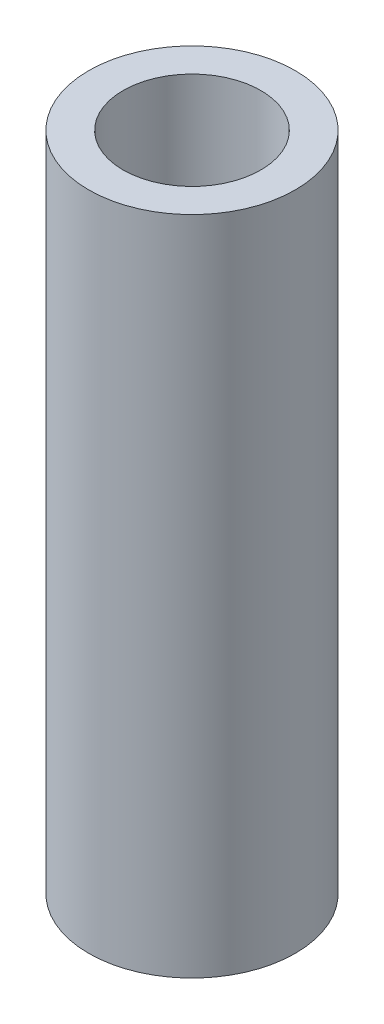
ISO-10303-21;
HEADER;
FILE_DESCRIPTION(('STEP AP214'),'2;1');
FILE_NAME('part.step','',(''),(''),'','','');
FILE_SCHEMA(('AUTOMOTIVE_DESIGN { 1 0 10303 214 1 1 1 1 }'));
ENDSEC;
DATA;
#1=APPLICATION_CONTEXT('core data for automotive mechanical design processes');
#2=APPLICATION_PROTOCOL_DEFINITION('international standard','automotive_design',2000,#1);
#3=PRODUCT_CONTEXT('',#1,'mechanical');
#4=PRODUCT('Part','Part','',(#3));
#5=PRODUCT_RELATED_PRODUCT_CATEGORY('part','',(#4));
#6=PRODUCT_DEFINITION_FORMATION('','',#4);
#7=PRODUCT_DEFINITION_CONTEXT('part definition',#1,'design');
#8=PRODUCT_DEFINITION('design','',#6,#7);
#9=PRODUCT_DEFINITION_SHAPE('','',#8);
#10=(LENGTH_UNIT() NAMED_UNIT(*) SI_UNIT(.MILLI.,.METRE.));
#11=(NAMED_UNIT(*) PLANE_ANGLE_UNIT() SI_UNIT($,.RADIAN.));
#12=(NAMED_UNIT(*) SI_UNIT($,.STERADIAN.) SOLID_ANGLE_UNIT());
#13=UNCERTAINTY_MEASURE_WITH_UNIT(LENGTH_MEASURE(1.E-05),#10,'distance_accuracy_value','');
#14=(GEOMETRIC_REPRESENTATION_CONTEXT(3) GLOBAL_UNCERTAINTY_ASSIGNED_CONTEXT((#13)) GLOBAL_UNIT_ASSIGNED_CONTEXT((#10,
#11,#12)) REPRESENTATION_CONTEXT('',''));
#15=CARTESIAN_POINT('',(0.,0.,0.));
#16=DIRECTION('',(0.,0.,1.));
#17=DIRECTION('',(1.,0.,0.));
#18=AXIS2_PLACEMENT_3D('',#15,#16,#17);
#19=CARTESIAN_POINT('',(0.,-30.48,0.));
#20=DIRECTION('',(0.,1.,0.));
#21=DIRECTION('',(0.,0.,1.));
#22=AXIS2_PLACEMENT_3D('',#19,#20,#21);
#23=CYLINDRICAL_SURFACE('',#22,9.525);
#24=CARTESIAN_POINT('',(0.,-30.48,0.));
#25=DIRECTION('',(0.,1.,0.));
#26=DIRECTION('',(0.,0.,1.));
#27=AXIS2_PLACEMENT_3D('',#24,#25,#26);
#28=CIRCLE('',#27,9.525);
#29=CARTESIAN_POINT('',(0.,-30.48,9.525));
#30=VERTEX_POINT('',#29);
#31=EDGE_CURVE('E10',#30,#30,#28,.T.);
#32=CARTESIAN_POINT('',(0.,30.48,0.));
#33=DIRECTION('',(0.,1.,0.));
#34=DIRECTION('',(0.,0.,1.));
#35=AXIS2_PLACEMENT_3D('',#32,#33,#34);
#36=CIRCLE('',#35,9.525);
#37=CARTESIAN_POINT('',(0.,30.48,9.525));
#38=VERTEX_POINT('',#37);
#39=EDGE_CURVE('E34',#38,#38,#36,.T.);
#40=CARTESIAN_POINT('',(0.,-30.48,9.525));
#41=CARTESIAN_POINT('',(0.,-29.845,9.525));
#42=CARTESIAN_POINT('',(0.,-29.21,9.525));
#43=CARTESIAN_POINT('',(0.,-27.94,9.525));
#44=CARTESIAN_POINT('',(0.,-27.305,9.525));
#45=CARTESIAN_POINT('',(0.,-26.035,9.525));
#46=CARTESIAN_POINT('',(0.,-25.4,9.525));
#47=CARTESIAN_POINT('',(0.,-24.13,9.525));
#48=CARTESIAN_POINT('',(0.,-23.495,9.525));
#49=CARTESIAN_POINT('',(0.,-22.225,9.525));
#50=CARTESIAN_POINT('',(0.,-21.59,9.525));
#51=CARTESIAN_POINT('',(0.,-20.32,9.525));
#52=CARTESIAN_POINT('',(0.,-19.685,9.525));
#53=CARTESIAN_POINT('',(0.,-18.415,9.525));
#54=CARTESIAN_POINT('',(0.,-17.78,9.525));
#55=CARTESIAN_POINT('',(0.,-16.51,9.525));
#56=CARTESIAN_POINT('',(0.,-15.875,9.525));
#57=CARTESIAN_POINT('',(0.,-14.605,9.525));
#58=CARTESIAN_POINT('',(0.,-13.97,9.525));
#59=CARTESIAN_POINT('',(0.,-12.7,9.525));
#60=CARTESIAN_POINT('',(0.,-12.065,9.525));
#61=CARTESIAN_POINT('',(0.,-10.795,9.525));
#62=CARTESIAN_POINT('',(0.,-10.16,9.525));
#63=CARTESIAN_POINT('',(0.,-8.89,9.525));
#64=CARTESIAN_POINT('',(0.,-8.255,9.525));
#65=CARTESIAN_POINT('',(0.,-6.985,9.525));
#66=CARTESIAN_POINT('',(0.,-6.35,9.525));
#67=CARTESIAN_POINT('',(0.,-5.08,9.525));
#68=CARTESIAN_POINT('',(0.,-4.445,9.525));
#69=CARTESIAN_POINT('',(0.,-3.175,9.525));
#70=CARTESIAN_POINT('',(0.,-2.54,9.525));
#71=CARTESIAN_POINT('',(0.,-1.27,9.525));
#72=CARTESIAN_POINT('',(0.,-0.635,9.525));
#73=CARTESIAN_POINT('',(0.,0.634999999999998,9.525));
#74=CARTESIAN_POINT('',(0.,1.27,9.525));
#75=CARTESIAN_POINT('',(0.,2.54,9.525));
#76=CARTESIAN_POINT('',(0.,3.175,9.525));
#77=CARTESIAN_POINT('',(0.,4.445,9.525));
#78=CARTESIAN_POINT('',(0.,5.07999999999999,9.525));
#79=CARTESIAN_POINT('',(0.,6.35,9.525));
#80=CARTESIAN_POINT('',(0.,6.985,9.525));
#81=CARTESIAN_POINT('',(0.,8.255,9.525));
#82=CARTESIAN_POINT('',(0.,8.89,9.525));
#83=CARTESIAN_POINT('',(0.,10.16,9.525));
#84=CARTESIAN_POINT('',(0.,10.795,9.525));
#85=CARTESIAN_POINT('',(0.,12.065,9.525));
#86=CARTESIAN_POINT('',(0.,12.7,9.525));
#87=CARTESIAN_POINT('',(0.,13.97,9.525));
#88=CARTESIAN_POINT('',(0.,14.605,9.525));
#89=CARTESIAN_POINT('',(0.,15.875,9.525));
#90=CARTESIAN_POINT('',(0.,16.51,9.525));
#91=CARTESIAN_POINT('',(0.,17.78,9.525));
#92=CARTESIAN_POINT('',(0.,18.415,9.525));
#93=CARTESIAN_POINT('',(0.,19.685,9.525));
#94=CARTESIAN_POINT('',(0.,20.32,9.525));
#95=CARTESIAN_POINT('',(0.,21.59,9.525));
#96=CARTESIAN_POINT('',(0.,22.225,9.525));
#97=CARTESIAN_POINT('',(0.,23.495,9.525));
#98=CARTESIAN_POINT('',(0.,24.13,9.525));
#99=CARTESIAN_POINT('',(0.,25.4,9.525));
#100=CARTESIAN_POINT('',(0.,26.035,9.525));
#101=CARTESIAN_POINT('',(0.,27.305,9.525));
#102=CARTESIAN_POINT('',(0.,27.94,9.525));
#103=CARTESIAN_POINT('',(0.,29.21,9.525));
#104=CARTESIAN_POINT('',(0.,29.845,9.525));
#105=CARTESIAN_POINT('',(0.,30.48,9.525));
#106=B_SPLINE_CURVE_WITH_KNOTS('',3,(#40,#41,#42,#43,#44,#45,#46,#47,#48,#49,#50,#51,#52,#53,
#54,#55,#56,#57,#58,#59,#60,#61,#62,#63,#64,#65,#66,#67,#68,#69,#70,#71,#72,#73,#74,#75,#76,#77,
#78,#79,#80,#81,#82,#83,#84,#85,#86,#87,#88,#89,#90,#91,#92,#93,#94,#95,#96,#97,#98,#99,#100,
#101,#102,#103,#104,#105),.UNSPECIFIED.,.F.,.F.,(4,2,2,2,2,2,2,2,2,2,2,2,2,2,2,2,2,2,2,2,2,2,2,
2,2,2,2,2,2,2,2,2,4),(0.,1.905,3.81,5.715,7.62,9.525,11.43,13.335,15.24,17.145,19.05,20.955,
22.86,24.765,26.67,28.575,30.48,32.385,34.29,36.195,38.1,40.005,41.91,43.815,45.72,47.625,49.53,
51.435,53.34,55.245,57.15,59.055,60.96),.UNSPECIFIED.);
#107=EDGE_CURVE('BSEAM28',#30,#38,#106,.T.);
#108=ORIENTED_EDGE('',*,*,#31,.T.);
#109=ORIENTED_EDGE('',*,*,#39,.F.);
#110=ORIENTED_EDGE('',*,*,#107,.T.);
#111=ORIENTED_EDGE('',*,*,#107,.F.);
#112=EDGE_LOOP('',(#108,#110,#109,#111));
#113=FACE_BOUND('',#112,.T.);
#114=ADVANCED_FACE('F28',(#113),#23,.T.);
#115=CARTESIAN_POINT('',(0.,-30.48,0.));
#116=DIRECTION('',(0.,1.,0.));
#117=DIRECTION('',(0.,0.,1.));
#118=AXIS2_PLACEMENT_3D('',#115,#116,#117);
#119=PLANE('',#118);
#120=CARTESIAN_POINT('',(0.,-30.48,0.));
#121=DIRECTION('',(0.,1.,0.));
#122=DIRECTION('',(0.,0.,1.));
#123=AXIS2_PLACEMENT_3D('',#120,#121,#122);
#124=CIRCLE('',#123,6.35);
#125=CARTESIAN_POINT('',(0.,-30.48,6.35));
#126=VERTEX_POINT('',#125);
#127=EDGE_CURVE('E38',#126,#126,#124,.T.);
#128=ORIENTED_EDGE('',*,*,#127,.T.);
#129=EDGE_LOOP('',(#128));
#130=FACE_BOUND('',#129,.T.);
#131=ORIENTED_EDGE('',*,*,#31,.F.);
#132=EDGE_LOOP('',(#131));
#133=FACE_BOUND('',#132,.T.);
#134=ADVANCED_FACE('F52',(#130,#133),#119,.F.);
#135=CARTESIAN_POINT('',(0.,30.48,0.));
#136=DIRECTION('',(0.,1.,0.));
#137=DIRECTION('',(0.,0.,1.));
#138=AXIS2_PLACEMENT_3D('',#135,#136,#137);
#139=PLANE('',#138);
#140=CARTESIAN_POINT('',(0.,30.48,0.));
#141=DIRECTION('',(0.,1.,0.));
#142=DIRECTION('',(0.,0.,1.));
#143=AXIS2_PLACEMENT_3D('',#140,#141,#142);
#144=CIRCLE('',#143,6.35);
#145=CARTESIAN_POINT('',(0.,30.48,6.35));
#146=VERTEX_POINT('',#145);
#147=EDGE_CURVE('E42',#146,#146,#144,.T.);
#148=ORIENTED_EDGE('',*,*,#147,.F.);
#149=EDGE_LOOP('',(#148));
#150=FACE_BOUND('',#149,.T.);
#151=ORIENTED_EDGE('',*,*,#39,.T.);
#152=EDGE_LOOP('',(#151));
#153=FACE_BOUND('',#152,.T.);
#154=ADVANCED_FACE('F50',(#150,#153),#139,.T.);
#155=CARTESIAN_POINT('',(0.,-30.48,0.));
#156=DIRECTION('',(0.,1.,0.));
#157=DIRECTION('',(0.,0.,1.));
#158=AXIS2_PLACEMENT_3D('',#155,#156,#157);
#159=CYLINDRICAL_SURFACE('',#158,6.35);
#160=CARTESIAN_POINT('',(0.,-30.48,6.35));
#161=CARTESIAN_POINT('',(0.,-29.845,6.35));
#162=CARTESIAN_POINT('',(0.,-29.21,6.35));
#163=CARTESIAN_POINT('',(0.,-27.94,6.35));
#164=CARTESIAN_POINT('',(0.,-27.305,6.35));
#165=CARTESIAN_POINT('',(0.,-26.035,6.35));
#166=CARTESIAN_POINT('',(0.,-25.4,6.35));
#167=CARTESIAN_POINT('',(0.,-24.13,6.35));
#168=CARTESIAN_POINT('',(0.,-23.495,6.35));
#169=CARTESIAN_POINT('',(0.,-22.225,6.35));
#170=CARTESIAN_POINT('',(0.,-21.59,6.35));
#171=CARTESIAN_POINT('',(0.,-20.32,6.35));
#172=CARTESIAN_POINT('',(0.,-19.685,6.35));
#173=CARTESIAN_POINT('',(0.,-18.415,6.35));
#174=CARTESIAN_POINT('',(0.,-17.78,6.35));
#175=CARTESIAN_POINT('',(0.,-16.51,6.35));
#176=CARTESIAN_POINT('',(0.,-15.875,6.35));
#177=CARTESIAN_POINT('',(0.,-14.605,6.35));
#178=CARTESIAN_POINT('',(0.,-13.97,6.35));
#179=CARTESIAN_POINT('',(0.,-12.7,6.35));
#180=CARTESIAN_POINT('',(0.,-12.065,6.35));
#181=CARTESIAN_POINT('',(0.,-10.795,6.35));
#182=CARTESIAN_POINT('',(0.,-10.16,6.35));
#183=CARTESIAN_POINT('',(0.,-8.89,6.35));
#184=CARTESIAN_POINT('',(0.,-8.255,6.35));
#185=CARTESIAN_POINT('',(0.,-6.985,6.35));
#186=CARTESIAN_POINT('',(0.,-6.35,6.35));
#187=CARTESIAN_POINT('',(0.,-5.08,6.35));
#188=CARTESIAN_POINT('',(0.,-4.445,6.35));
#189=CARTESIAN_POINT('',(0.,-3.175,6.35));
#190=CARTESIAN_POINT('',(0.,-2.54,6.35));
#191=CARTESIAN_POINT('',(0.,-1.27,6.35));
#192=CARTESIAN_POINT('',(0.,-0.635,6.35));
#193=CARTESIAN_POINT('',(0.,0.634999999999998,6.35));
#194=CARTESIAN_POINT('',(0.,1.27,6.35));
#195=CARTESIAN_POINT('',(0.,2.54,6.35));
#196=CARTESIAN_POINT('',(0.,3.175,6.35));
#197=CARTESIAN_POINT('',(0.,4.445,6.35));
#198=CARTESIAN_POINT('',(0.,5.07999999999999,6.35));
#199=CARTESIAN_POINT('',(0.,6.35,6.35));
#200=CARTESIAN_POINT('',(0.,6.985,6.35));
#201=CARTESIAN_POINT('',(0.,8.255,6.35));
#202=CARTESIAN_POINT('',(0.,8.89,6.35));
#203=CARTESIAN_POINT('',(0.,10.16,6.35));
#204=CARTESIAN_POINT('',(0.,10.795,6.35));
#205=CARTESIAN_POINT('',(0.,12.065,6.35));
#206=CARTESIAN_POINT('',(0.,12.7,6.35));
#207=CARTESIAN_POINT('',(0.,13.97,6.35));
#208=CARTESIAN_POINT('',(0.,14.605,6.35));
#209=CARTESIAN_POINT('',(0.,15.875,6.35));
#210=CARTESIAN_POINT('',(0.,16.51,6.35));
#211=CARTESIAN_POINT('',(0.,17.78,6.35));
#212=CARTESIAN_POINT('',(0.,18.415,6.35));
#213=CARTESIAN_POINT('',(0.,19.685,6.35));
#214=CARTESIAN_POINT('',(0.,20.32,6.35));
#215=CARTESIAN_POINT('',(0.,21.59,6.35));
#216=CARTESIAN_POINT('',(0.,22.225,6.35));
#217=CARTESIAN_POINT('',(0.,23.495,6.35));
#218=CARTESIAN_POINT('',(0.,24.13,6.35));
#219=CARTESIAN_POINT('',(0.,25.4,6.35));
#220=CARTESIAN_POINT('',(0.,26.035,6.35));
#221=CARTESIAN_POINT('',(0.,27.305,6.35));
#222=CARTESIAN_POINT('',(0.,27.94,6.35));
#223=CARTESIAN_POINT('',(0.,29.21,6.35));
#224=CARTESIAN_POINT('',(0.,29.845,6.35));
#225=CARTESIAN_POINT('',(0.,30.48,6.35));
#226=B_SPLINE_CURVE_WITH_KNOTS('',3,(#160,#161,#162,#163,#164,#165,#166,#167,#168,#169,#170,
#171,#172,#173,#174,#175,#176,#177,#178,#179,#180,#181,#182,#183,#184,#185,#186,#187,#188,#189,
#190,#191,#192,#193,#194,#195,#196,#197,#198,#199,#200,#201,#202,#203,#204,#205,#206,#207,#208,
#209,#210,#211,#212,#213,#214,#215,#216,#217,#218,#219,#220,#221,#222,#223,#224,#225),
.UNSPECIFIED.,.F.,.F.,(4,2,2,2,2,2,2,2,2,2,2,2,2,2,2,2,2,2,2,2,2,2,2,2,2,2,2,2,2,2,2,2,4),(0.,
1.905,3.81,5.715,7.62,9.525,11.43,13.335,15.24,17.145,19.05,20.955,22.86,24.765,26.67,28.575,
30.48,32.385,34.29,36.195,38.1,40.005,41.91,43.815,45.72,47.625,49.53,51.435,53.34,55.245,57.15,
59.055,60.96),.UNSPECIFIED.);
#227=EDGE_CURVE('BSEAM48',#126,#146,#226,.T.);
#228=ORIENTED_EDGE('',*,*,#127,.F.);
#229=ORIENTED_EDGE('',*,*,#147,.T.);
#230=ORIENTED_EDGE('',*,*,#227,.T.);
#231=ORIENTED_EDGE('',*,*,#227,.F.);
#232=EDGE_LOOP('',(#228,#230,#229,#231));
#233=FACE_BOUND('',#232,.T.);
#234=ADVANCED_FACE('F48',(#233),#159,.F.);
#235=CLOSED_SHELL('',(#114,#134,#154,#234));
#236=MANIFOLD_SOLID_BREP('B2',#235);
#237=ADVANCED_BREP_SHAPE_REPRESENTATION('',(#18,#236),#14);
#238=SHAPE_DEFINITION_REPRESENTATION(#9,#237);
ENDSEC;
END-ISO-10303-21;
